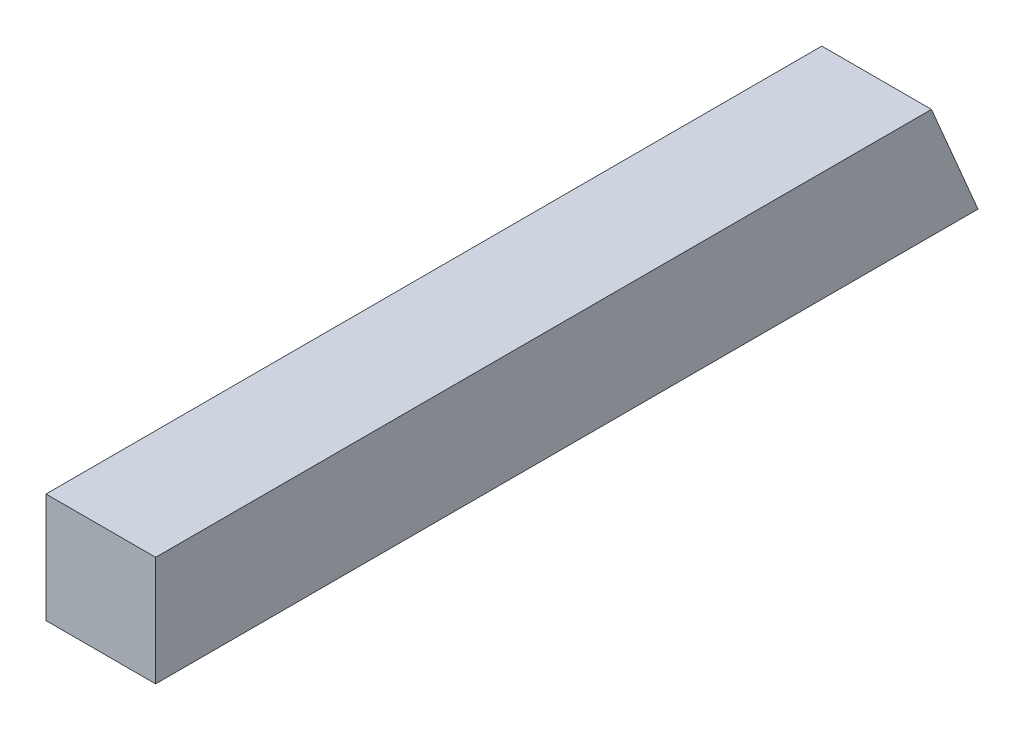
ISO-10303-21;
HEADER;
FILE_DESCRIPTION(('STEP AP214'),'2;1');
FILE_NAME('part.step','',(''),(''),'','','');
FILE_SCHEMA(('AUTOMOTIVE_DESIGN { 1 0 10303 214 1 1 1 1 }'));
ENDSEC;
DATA;
#1=APPLICATION_CONTEXT('core data for automotive mechanical design processes');
#2=APPLICATION_PROTOCOL_DEFINITION('international standard','automotive_design',2000,#1);
#3=PRODUCT_CONTEXT('',#1,'mechanical');
#4=PRODUCT('Part','Part','',(#3));
#5=PRODUCT_RELATED_PRODUCT_CATEGORY('part','',(#4));
#6=PRODUCT_DEFINITION_FORMATION('','',#4);
#7=PRODUCT_DEFINITION_CONTEXT('part definition',#1,'design');
#8=PRODUCT_DEFINITION('design','',#6,#7);
#9=PRODUCT_DEFINITION_SHAPE('','',#8);
#10=(LENGTH_UNIT() NAMED_UNIT(*) SI_UNIT(.MILLI.,.METRE.));
#11=(NAMED_UNIT(*) PLANE_ANGLE_UNIT() SI_UNIT($,.RADIAN.));
#12=(NAMED_UNIT(*) SI_UNIT($,.STERADIAN.) SOLID_ANGLE_UNIT());
#13=UNCERTAINTY_MEASURE_WITH_UNIT(LENGTH_MEASURE(1.E-05),#10,'distance_accuracy_value','');
#14=(GEOMETRIC_REPRESENTATION_CONTEXT(3) GLOBAL_UNCERTAINTY_ASSIGNED_CONTEXT((#13)) GLOBAL_UNIT_ASSIGNED_CONTEXT((#10,
#11,#12)) REPRESENTATION_CONTEXT('',''));
#15=CARTESIAN_POINT('',(0.,0.,0.));
#16=DIRECTION('',(0.,0.,1.));
#17=DIRECTION('',(1.,0.,0.));
#18=AXIS2_PLACEMENT_3D('',#15,#16,#17);
#19=CARTESIAN_POINT('',(10.,10.,150.));
#20=DIRECTION('',(-1.,0.,0.));
#21=DIRECTION('',(0.,-1.,0.));
#22=AXIS2_PLACEMENT_3D('',#19,#20,#21);
#23=PLANE('',#22);
#24=DIRECTION('',(0.,0.,-1.));
#25=VECTOR('',#24,1.);
#26=CARTESIAN_POINT('',(10.,-10.,150.));
#27=LINE('',#26,#25);
#28=CARTESIAN_POINT('',(10.,-10.,150.));
#29=VERTEX_POINT('',#28);
#30=CARTESIAN_POINT('',(10.,-10.,0.));
#31=VERTEX_POINT('',#30);
#32=EDGE_CURVE('E93',#29,#31,#27,.T.);
#33=ORIENTED_EDGE('',*,*,#32,.T.);
#34=DIRECTION('',(0.,-0.920504853452443,-0.390731128489267));
#35=VECTOR('',#34,1.);
#36=CARTESIAN_POINT('',(10.,-10.,0.));
#37=LINE('',#36,#35);
#38=CARTESIAN_POINT('',(9.99999999999999,10.,8.48949632419194));
#39=VERTEX_POINT('',#38);
#40=EDGE_CURVE('E82',#39,#31,#37,.T.);
#41=ORIENTED_EDGE('',*,*,#40,.F.);
#42=DIRECTION('',(0.,0.,-1.));
#43=VECTOR('',#42,1.);
#44=CARTESIAN_POINT('',(10.,10.,150.));
#45=LINE('',#44,#43);
#46=CARTESIAN_POINT('',(10.,10.,150.));
#47=VERTEX_POINT('',#46);
#48=EDGE_CURVE('E11',#47,#39,#45,.T.);
#49=ORIENTED_EDGE('',*,*,#48,.F.);
#50=DIRECTION('',(0.,1.,0.));
#51=VECTOR('',#50,1.);
#52=CARTESIAN_POINT('',(10.,10.,150.));
#53=LINE('',#52,#51);
#54=EDGE_CURVE('E99',#29,#47,#53,.T.);
#55=ORIENTED_EDGE('',*,*,#54,.F.);
#56=EDGE_LOOP('',(#33,#41,#49,#55));
#57=FACE_BOUND('',#56,.T.);
#58=ADVANCED_FACE('F35',(#57),#23,.F.);
#59=CARTESIAN_POINT('',(-10.,10.,150.));
#60=DIRECTION('',(0.,-1.,0.));
#61=DIRECTION('',(0.,0.,-1.));
#62=AXIS2_PLACEMENT_3D('',#59,#60,#61);
#63=PLANE('',#62);
#64=ORIENTED_EDGE('',*,*,#48,.T.);
#65=DIRECTION('',(1.,0.,0.));
#66=VECTOR('',#65,1.);
#67=CARTESIAN_POINT('',(-10.,9.99999999999999,8.48949632419194));
#68=LINE('',#67,#66);
#69=CARTESIAN_POINT('',(-10.,9.99999999999999,8.48949632419194));
#70=VERTEX_POINT('',#69);
#71=EDGE_CURVE('E74',#70,#39,#68,.T.);
#72=ORIENTED_EDGE('',*,*,#71,.F.);
#73=DIRECTION('',(0.,0.,-1.));
#74=VECTOR('',#73,1.);
#75=CARTESIAN_POINT('',(-10.,10.,150.));
#76=LINE('',#75,#74);
#77=CARTESIAN_POINT('',(-10.,10.,150.));
#78=VERTEX_POINT('',#77);
#79=EDGE_CURVE('E43',#78,#70,#76,.T.);
#80=ORIENTED_EDGE('',*,*,#79,.F.);
#81=DIRECTION('',(-1.,0.,0.));
#82=VECTOR('',#81,1.);
#83=CARTESIAN_POINT('',(-10.,10.,150.));
#84=LINE('',#83,#82);
#85=EDGE_CURVE('E102',#47,#78,#84,.T.);
#86=ORIENTED_EDGE('',*,*,#85,.F.);
#87=EDGE_LOOP('',(#64,#72,#80,#86));
#88=FACE_BOUND('',#87,.T.);
#89=ADVANCED_FACE('F86',(#88),#63,.F.);
#90=CARTESIAN_POINT('',(-10.,10.,150.));
#91=DIRECTION('',(1.,0.,0.));
#92=DIRECTION('',(0.,1.,0.));
#93=AXIS2_PLACEMENT_3D('',#90,#91,#92);
#94=PLANE('',#93);
#95=ORIENTED_EDGE('',*,*,#79,.T.);
#96=DIRECTION('',(0.,-0.920504853452443,-0.390731128489267));
#97=VECTOR('',#96,1.);
#98=CARTESIAN_POINT('',(-10.,-10.,0.));
#99=LINE('',#98,#97);
#100=CARTESIAN_POINT('',(-10.,-10.,0.));
#101=VERTEX_POINT('',#100);
#102=EDGE_CURVE('E70',#70,#101,#99,.T.);
#103=ORIENTED_EDGE('',*,*,#102,.T.);
#104=DIRECTION('',(0.,0.,-1.));
#105=VECTOR('',#104,1.);
#106=CARTESIAN_POINT('',(-10.,-10.,150.));
#107=LINE('',#106,#105);
#108=CARTESIAN_POINT('',(-10.,-10.,150.));
#109=VERTEX_POINT('',#108);
#110=EDGE_CURVE('E92',#109,#101,#107,.T.);
#111=ORIENTED_EDGE('',*,*,#110,.F.);
#112=DIRECTION('',(0.,-1.,0.));
#113=VECTOR('',#112,1.);
#114=CARTESIAN_POINT('',(-10.,10.,150.));
#115=LINE('',#114,#113);
#116=EDGE_CURVE('E91',#78,#109,#115,.T.);
#117=ORIENTED_EDGE('',*,*,#116,.F.);
#118=EDGE_LOOP('',(#95,#103,#111,#117));
#119=FACE_BOUND('',#118,.T.);
#120=ADVANCED_FACE('F90',(#119),#94,.F.);
#121=CARTESIAN_POINT('',(-10.,-10.,150.));
#122=DIRECTION('',(0.,1.,0.));
#123=DIRECTION('',(0.,0.,1.));
#124=AXIS2_PLACEMENT_3D('',#121,#122,#123);
#125=PLANE('',#124);
#126=DIRECTION('',(1.,0.,0.));
#127=VECTOR('',#126,1.);
#128=CARTESIAN_POINT('',(-10.,-10.,0.));
#129=LINE('',#128,#127);
#130=EDGE_CURVE('E77',#101,#31,#129,.T.);
#131=ORIENTED_EDGE('',*,*,#130,.T.);
#132=ORIENTED_EDGE('',*,*,#32,.F.);
#133=DIRECTION('',(1.,0.,0.));
#134=VECTOR('',#133,1.);
#135=CARTESIAN_POINT('',(-10.,-10.,150.));
#136=LINE('',#135,#134);
#137=EDGE_CURVE('E50',#109,#29,#136,.T.);
#138=ORIENTED_EDGE('',*,*,#137,.F.);
#139=ORIENTED_EDGE('',*,*,#110,.T.);
#140=EDGE_LOOP('',(#131,#132,#138,#139));
#141=FACE_BOUND('',#140,.T.);
#142=ADVANCED_FACE('F107',(#141),#125,.F.);
#143=CARTESIAN_POINT('',(0.,0.,150.));
#144=DIRECTION('',(0.,0.,1.));
#145=DIRECTION('',(1.,0.,0.));
#146=AXIS2_PLACEMENT_3D('',#143,#144,#145);
#147=PLANE('',#146);
#148=ORIENTED_EDGE('',*,*,#54,.T.);
#149=ORIENTED_EDGE('',*,*,#85,.T.);
#150=ORIENTED_EDGE('',*,*,#116,.T.);
#151=ORIENTED_EDGE('',*,*,#137,.T.);
#152=EDGE_LOOP('',(#148,#149,#150,#151));
#153=FACE_BOUND('',#152,.T.);
#154=ADVANCED_FACE('F109',(#153),#147,.T.);
#155=CARTESIAN_POINT('',(-10.,-10.,0.));
#156=DIRECTION('',(0.,-0.390731128489268,0.920504853452443));
#157=DIRECTION('',(0.,-0.920504853452443,-0.390731128489268));
#158=AXIS2_PLACEMENT_3D('',#155,#156,#157);
#159=PLANE('',#158);
#160=ORIENTED_EDGE('',*,*,#40,.T.);
#161=ORIENTED_EDGE('',*,*,#130,.F.);
#162=ORIENTED_EDGE('',*,*,#102,.F.);
#163=ORIENTED_EDGE('',*,*,#71,.T.);
#164=EDGE_LOOP('',(#160,#161,#162,#163));
#165=FACE_BOUND('',#164,.T.);
#166=ADVANCED_FACE('F73',(#165),#159,.F.);
#167=CLOSED_SHELL('',(#58,#89,#120,#142,#154,#166));
#168=MANIFOLD_SOLID_BREP('B2',#167);
#169=ADVANCED_BREP_SHAPE_REPRESENTATION('',(#18,#168),#14);
#170=SHAPE_DEFINITION_REPRESENTATION(#9,#169);
ENDSEC;
END-ISO-10303-21;
